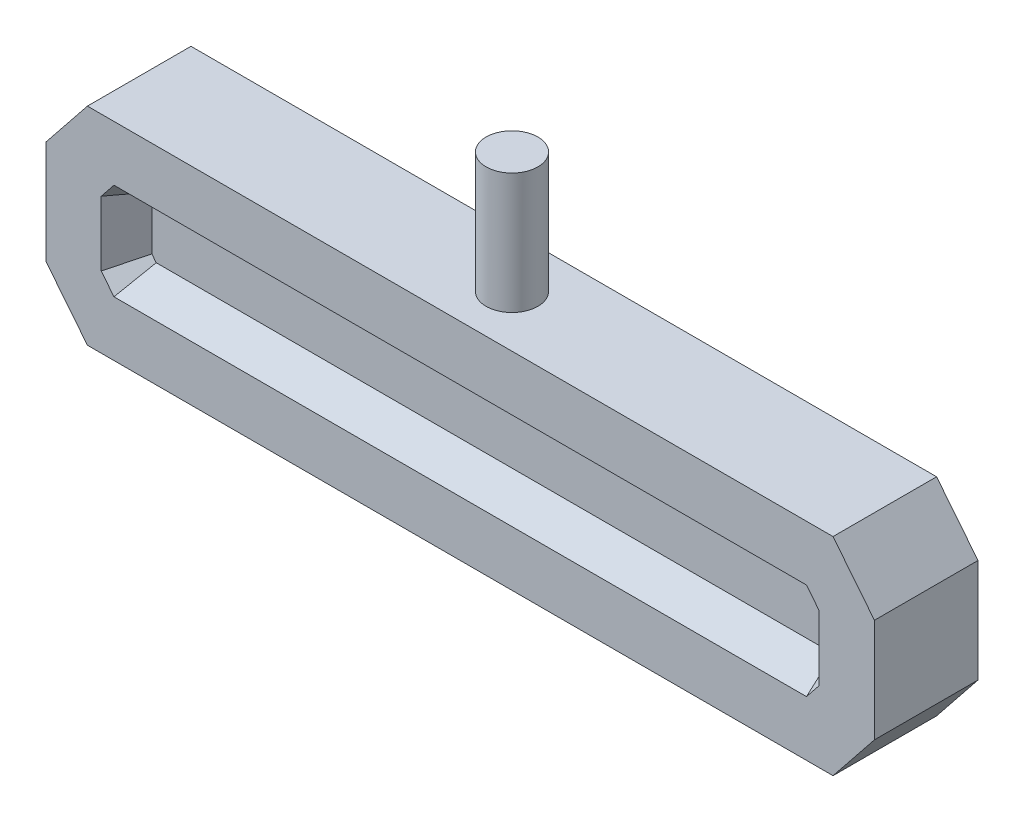
ISO-10303-21;
HEADER;
FILE_DESCRIPTION(('STEP AP214'),'2;1');
FILE_NAME('part.step','',(''),(''),'','','');
FILE_SCHEMA(('AUTOMOTIVE_DESIGN { 1 0 10303 214 1 1 1 1 }'));
ENDSEC;
DATA;
#1=APPLICATION_CONTEXT('core data for automotive mechanical design processes');
#2=APPLICATION_PROTOCOL_DEFINITION('international standard','automotive_design',2000,#1);
#3=PRODUCT_CONTEXT('',#1,'mechanical');
#4=PRODUCT('Part','Part','',(#3));
#5=PRODUCT_RELATED_PRODUCT_CATEGORY('part','',(#4));
#6=PRODUCT_DEFINITION_FORMATION('','',#4);
#7=PRODUCT_DEFINITION_CONTEXT('part definition',#1,'design');
#8=PRODUCT_DEFINITION('design','',#6,#7);
#9=PRODUCT_DEFINITION_SHAPE('','',#8);
#10=(LENGTH_UNIT() NAMED_UNIT(*) SI_UNIT(.MILLI.,.METRE.));
#11=(NAMED_UNIT(*) PLANE_ANGLE_UNIT() SI_UNIT($,.RADIAN.));
#12=(NAMED_UNIT(*) SI_UNIT($,.STERADIAN.) SOLID_ANGLE_UNIT());
#13=UNCERTAINTY_MEASURE_WITH_UNIT(LENGTH_MEASURE(1.E-05),#10,'distance_accuracy_value','');
#14=(GEOMETRIC_REPRESENTATION_CONTEXT(3) GLOBAL_UNCERTAINTY_ASSIGNED_CONTEXT((#13)) GLOBAL_UNIT_ASSIGNED_CONTEXT((#10,
#11,#12)) REPRESENTATION_CONTEXT('',''));
#15=CARTESIAN_POINT('',(0.,0.,0.));
#16=DIRECTION('',(0.,0.,1.));
#17=DIRECTION('',(1.,0.,0.));
#18=AXIS2_PLACEMENT_3D('',#15,#16,#17);
#19=CARTESIAN_POINT('',(0.,0.,19.05));
#20=DIRECTION('',(0.,0.,-1.));
#21=DIRECTION('',(-1.,0.,0.));
#22=AXIS2_PLACEMENT_3D('',#19,#20,#21);
#23=PLANE('',#22);
#24=DIRECTION('',(-0.624695047554425,0.78086880944303,0.));
#25=VECTOR('',#24,1.);
#26=CARTESIAN_POINT('',(137.16,76.2,19.05));
#27=LINE('',#26,#25);
#28=CARTESIAN_POINT('',(152.4,57.15,19.05));
#29=VERTEX_POINT('',#28);
#30=CARTESIAN_POINT('',(137.16,76.2,19.05));
#31=VERTEX_POINT('',#30);
#32=EDGE_CURVE('E249',#29,#31,#27,.T.);
#33=ORIENTED_EDGE('',*,*,#32,.T.);
#34=DIRECTION('',(-1.,0.,0.));
#35=VECTOR('',#34,1.);
#36=CARTESIAN_POINT('',(-137.16,76.2,19.05));
#37=LINE('',#36,#35);
#38=CARTESIAN_POINT('',(-137.16,76.2,19.05));
#39=VERTEX_POINT('',#38);
#40=EDGE_CURVE('E177',#31,#39,#37,.T.);
#41=ORIENTED_EDGE('',*,*,#40,.T.);
#42=DIRECTION('',(-0.624695047554425,-0.78086880944303,0.));
#43=VECTOR('',#42,1.);
#44=CARTESIAN_POINT('',(-137.16,76.2,19.05));
#45=LINE('',#44,#43);
#46=CARTESIAN_POINT('',(-152.4,57.15,19.05));
#47=VERTEX_POINT('',#46);
#48=EDGE_CURVE('E288',#39,#47,#45,.T.);
#49=ORIENTED_EDGE('',*,*,#48,.T.);
#50=DIRECTION('',(0.,-1.,0.));
#51=VECTOR('',#50,1.);
#52=CARTESIAN_POINT('',(-152.4,57.15,19.05));
#53=LINE('',#52,#51);
#54=CARTESIAN_POINT('',(-152.4,19.05,19.05));
#55=VERTEX_POINT('',#54);
#56=EDGE_CURVE('E286',#47,#55,#53,.T.);
#57=ORIENTED_EDGE('',*,*,#56,.T.);
#58=DIRECTION('',(0.624695047554424,-0.780868809443031,0.));
#59=VECTOR('',#58,1.);
#60=CARTESIAN_POINT('',(-152.4,19.05,19.05));
#61=LINE('',#60,#59);
#62=CARTESIAN_POINT('',(-137.16,0.,19.05));
#63=VERTEX_POINT('',#62);
#64=EDGE_CURVE('E200',#55,#63,#61,.T.);
#65=ORIENTED_EDGE('',*,*,#64,.T.);
#66=DIRECTION('',(1.,0.,0.));
#67=VECTOR('',#66,1.);
#68=CARTESIAN_POINT('',(137.16,0.,19.05));
#69=LINE('',#68,#67);
#70=CARTESIAN_POINT('',(137.16,0.,19.05));
#71=VERTEX_POINT('',#70);
#72=EDGE_CURVE('E193',#63,#71,#69,.T.);
#73=ORIENTED_EDGE('',*,*,#72,.T.);
#74=DIRECTION('',(0.624695047554424,0.780868809443031,0.));
#75=VECTOR('',#74,1.);
#76=CARTESIAN_POINT('',(152.4,19.05,19.05));
#77=LINE('',#76,#75);
#78=CARTESIAN_POINT('',(152.4,19.05,19.05));
#79=VERTEX_POINT('',#78);
#80=EDGE_CURVE('E197',#71,#79,#77,.T.);
#81=ORIENTED_EDGE('',*,*,#80,.T.);
#82=DIRECTION('',(0.,1.,0.));
#83=VECTOR('',#82,1.);
#84=CARTESIAN_POINT('',(152.4,57.15,19.05));
#85=LINE('',#84,#83);
#86=EDGE_CURVE('E135',#79,#29,#85,.T.);
#87=ORIENTED_EDGE('',*,*,#86,.T.);
#88=EDGE_LOOP('',(#33,#41,#49,#57,#65,#73,#81,#87));
#89=FACE_BOUND('',#88,.T.);
#90=DIRECTION('',(0.624695047554436,-0.780868809443021,0.));
#91=VECTOR('',#90,1.);
#92=CARTESIAN_POINT('',(-132.08,26.1778711261586,19.05));
#93=LINE('',#92,#91);
#94=CARTESIAN_POINT('',(-132.08,26.1778711261586,19.05));
#95=VERTEX_POINT('',#94);
#96=CARTESIAN_POINT('',(-127.393703099073,20.3200000000005,19.05));
#97=VERTEX_POINT('',#96);
#98=EDGE_CURVE('E126',#95,#97,#93,.T.);
#99=ORIENTED_EDGE('',*,*,#98,.F.);
#100=DIRECTION('',(0.,-1.,0.));
#101=VECTOR('',#100,1.);
#102=CARTESIAN_POINT('',(-132.08,50.022128873841,19.05));
#103=LINE('',#102,#101);
#104=CARTESIAN_POINT('',(-132.08,50.022128873841,19.05));
#105=VERTEX_POINT('',#104);
#106=EDGE_CURVE('E327',#105,#95,#103,.T.);
#107=ORIENTED_EDGE('',*,*,#106,.F.);
#108=DIRECTION('',(-0.624695047554414,-0.780868809443039,0.));
#109=VECTOR('',#108,1.);
#110=CARTESIAN_POINT('',(-127.393703099073,55.88,19.05));
#111=LINE('',#110,#109);
#112=CARTESIAN_POINT('',(-127.393703099073,55.88,19.05));
#113=VERTEX_POINT('',#112);
#114=EDGE_CURVE('E321',#113,#105,#111,.T.);
#115=ORIENTED_EDGE('',*,*,#114,.F.);
#116=DIRECTION('',(-1.,0.,0.));
#117=VECTOR('',#116,1.);
#118=CARTESIAN_POINT('',(127.393703099073,55.8800000000001,19.05));
#119=LINE('',#118,#117);
#120=CARTESIAN_POINT('',(127.393703099073,55.8800000000001,19.05));
#121=VERTEX_POINT('',#120);
#122=EDGE_CURVE('E315',#121,#113,#119,.T.);
#123=ORIENTED_EDGE('',*,*,#122,.F.);
#124=DIRECTION('',(-0.62469504755443,0.780868809443026,0.));
#125=VECTOR('',#124,1.);
#126=CARTESIAN_POINT('',(132.08,50.0221288738412,19.05));
#127=LINE('',#126,#125);
#128=CARTESIAN_POINT('',(132.08,50.0221288738412,19.05));
#129=VERTEX_POINT('',#128);
#130=EDGE_CURVE('E309',#129,#121,#127,.T.);
#131=ORIENTED_EDGE('',*,*,#130,.F.);
#132=DIRECTION('',(0.,1.,0.));
#133=VECTOR('',#132,1.);
#134=CARTESIAN_POINT('',(132.080000000001,26.1778711261595,19.05));
#135=LINE('',#134,#133);
#136=CARTESIAN_POINT('',(132.080000000001,26.1778711261595,19.05));
#137=VERTEX_POINT('',#136);
#138=EDGE_CURVE('E303',#137,#129,#135,.T.);
#139=ORIENTED_EDGE('',*,*,#138,.F.);
#140=DIRECTION('',(0.624695047554415,0.780868809443037,0.));
#141=VECTOR('',#140,1.);
#142=CARTESIAN_POINT('',(127.393703099073,20.32,19.05));
#143=LINE('',#142,#141);
#144=CARTESIAN_POINT('',(127.393703099073,20.32,19.05));
#145=VERTEX_POINT('',#144);
#146=EDGE_CURVE('E344',#145,#137,#143,.T.);
#147=ORIENTED_EDGE('',*,*,#146,.F.);
#148=DIRECTION('',(1.,0.,0.));
#149=VECTOR('',#148,1.);
#150=CARTESIAN_POINT('',(-127.393703099073,20.3200000000004,19.05));
#151=LINE('',#150,#149);
#152=EDGE_CURVE('E230',#97,#145,#151,.T.);
#153=ORIENTED_EDGE('',*,*,#152,.F.);
#154=EDGE_LOOP('',(#99,#107,#115,#123,#131,#139,#147,#153));
#155=FACE_BOUND('',#154,.T.);
#156=ADVANCED_FACE('F110',(#89,#155),#23,.F.);
#157=CARTESIAN_POINT('',(137.16,76.2,19.05));
#158=DIRECTION('',(-0.78086880944303,-0.624695047554425,0.));
#159=DIRECTION('',(0.624695047554425,-0.78086880944303,0.));
#160=AXIS2_PLACEMENT_3D('',#157,#158,#159);
#161=PLANE('',#160);
#162=DIRECTION('',(-0.624695047554425,0.78086880944303,0.));
#163=VECTOR('',#162,1.);
#164=CARTESIAN_POINT('',(137.16,76.2,-19.05));
#165=LINE('',#164,#163);
#166=CARTESIAN_POINT('',(152.4,57.15,-19.05));
#167=VERTEX_POINT('',#166);
#168=CARTESIAN_POINT('',(137.16,76.2,-19.05));
#169=VERTEX_POINT('',#168);
#170=EDGE_CURVE('E225',#167,#169,#165,.T.);
#171=ORIENTED_EDGE('',*,*,#170,.T.);
#172=DIRECTION('',(0.,0.,-1.));
#173=VECTOR('',#172,1.);
#174=CARTESIAN_POINT('',(137.16,76.2,19.05));
#175=LINE('',#174,#173);
#176=EDGE_CURVE('E119',#31,#169,#175,.T.);
#177=ORIENTED_EDGE('',*,*,#176,.F.);
#178=ORIENTED_EDGE('',*,*,#32,.F.);
#179=DIRECTION('',(0.,0.,-1.));
#180=VECTOR('',#179,1.);
#181=CARTESIAN_POINT('',(152.4,57.15,19.05));
#182=LINE('',#181,#180);
#183=EDGE_CURVE('E221',#29,#167,#182,.T.);
#184=ORIENTED_EDGE('',*,*,#183,.T.);
#185=EDGE_LOOP('',(#171,#177,#178,#184));
#186=FACE_BOUND('',#185,.T.);
#187=ADVANCED_FACE('F112',(#186),#161,.F.);
#188=CARTESIAN_POINT('',(-137.16,76.2,19.05));
#189=DIRECTION('',(0.,-1.,0.));
#190=DIRECTION('',(0.,0.,-1.));
#191=AXIS2_PLACEMENT_3D('',#188,#189,#190);
#192=PLANE('',#191);
#193=CARTESIAN_POINT('',(0.,76.2,0.));
#194=DIRECTION('',(0.,-1.,0.));
#195=DIRECTION('',(0.,0.,-1.));
#196=AXIS2_PLACEMENT_3D('',#193,#194,#195);
#197=CIRCLE('',#196,9.525);
#198=CARTESIAN_POINT('',(0.,76.2,-9.525));
#199=VERTEX_POINT('',#198);
#200=EDGE_CURVE('E12',#199,#199,#197,.F.);
#201=ORIENTED_EDGE('',*,*,#200,.F.);
#202=EDGE_LOOP('',(#201));
#203=FACE_BOUND('',#202,.T.);
#204=DIRECTION('',(-1.,0.,0.));
#205=VECTOR('',#204,1.);
#206=CARTESIAN_POINT('',(-137.16,76.2,-19.05));
#207=LINE('',#206,#205);
#208=CARTESIAN_POINT('',(-137.16,76.2,-19.05));
#209=VERTEX_POINT('',#208);
#210=EDGE_CURVE('E229',#169,#209,#207,.T.);
#211=ORIENTED_EDGE('',*,*,#210,.T.);
#212=DIRECTION('',(0.,0.,-1.));
#213=VECTOR('',#212,1.);
#214=CARTESIAN_POINT('',(-137.16,76.2,19.05));
#215=LINE('',#214,#213);
#216=EDGE_CURVE('E264',#39,#209,#215,.T.);
#217=ORIENTED_EDGE('',*,*,#216,.F.);
#218=ORIENTED_EDGE('',*,*,#40,.F.);
#219=ORIENTED_EDGE('',*,*,#176,.T.);
#220=EDGE_LOOP('',(#211,#217,#218,#219));
#221=FACE_BOUND('',#220,.T.);
#222=ADVANCED_FACE('F269',(#203,#221),#192,.F.);
#223=CARTESIAN_POINT('',(-137.16,76.2,19.05));
#224=DIRECTION('',(0.78086880944303,-0.624695047554425,0.));
#225=DIRECTION('',(0.624695047554425,0.78086880944303,0.));
#226=AXIS2_PLACEMENT_3D('',#223,#224,#225);
#227=PLANE('',#226);
#228=DIRECTION('',(-0.624695047554425,-0.78086880944303,0.));
#229=VECTOR('',#228,1.);
#230=CARTESIAN_POINT('',(-137.16,76.2,-19.05));
#231=LINE('',#230,#229);
#232=CARTESIAN_POINT('',(-152.4,57.15,-19.05));
#233=VERTEX_POINT('',#232);
#234=EDGE_CURVE('E233',#209,#233,#231,.T.);
#235=ORIENTED_EDGE('',*,*,#234,.T.);
#236=DIRECTION('',(0.,0.,-1.));
#237=VECTOR('',#236,1.);
#238=CARTESIAN_POINT('',(-152.4,57.15,19.05));
#239=LINE('',#238,#237);
#240=EDGE_CURVE('E260',#47,#233,#239,.T.);
#241=ORIENTED_EDGE('',*,*,#240,.F.);
#242=ORIENTED_EDGE('',*,*,#48,.F.);
#243=ORIENTED_EDGE('',*,*,#216,.T.);
#244=EDGE_LOOP('',(#235,#241,#242,#243));
#245=FACE_BOUND('',#244,.T.);
#246=ADVANCED_FACE('F280',(#245),#227,.F.);
#247=CARTESIAN_POINT('',(-152.4,57.15,19.05));
#248=DIRECTION('',(1.,0.,0.));
#249=DIRECTION('',(0.,0.,-1.));
#250=AXIS2_PLACEMENT_3D('',#247,#248,#249);
#251=PLANE('',#250);
#252=DIRECTION('',(0.,-1.,0.));
#253=VECTOR('',#252,1.);
#254=CARTESIAN_POINT('',(-152.4,57.15,-19.05));
#255=LINE('',#254,#253);
#256=CARTESIAN_POINT('',(-152.4,19.05,-19.05));
#257=VERTEX_POINT('',#256);
#258=EDGE_CURVE('E236',#233,#257,#255,.T.);
#259=ORIENTED_EDGE('',*,*,#258,.T.);
#260=DIRECTION('',(0.,0.,-1.));
#261=VECTOR('',#260,1.);
#262=CARTESIAN_POINT('',(-152.4,19.05,19.05));
#263=LINE('',#262,#261);
#264=EDGE_CURVE('E256',#55,#257,#263,.T.);
#265=ORIENTED_EDGE('',*,*,#264,.F.);
#266=ORIENTED_EDGE('',*,*,#56,.F.);
#267=ORIENTED_EDGE('',*,*,#240,.T.);
#268=EDGE_LOOP('',(#259,#265,#266,#267));
#269=FACE_BOUND('',#268,.T.);
#270=ADVANCED_FACE('F284',(#269),#251,.F.);
#271=CARTESIAN_POINT('',(-152.4,19.05,19.05));
#272=DIRECTION('',(0.780868809443031,0.624695047554424,0.));
#273=DIRECTION('',(-0.624695047554424,0.780868809443031,0.));
#274=AXIS2_PLACEMENT_3D('',#271,#272,#273);
#275=PLANE('',#274);
#276=DIRECTION('',(0.624695047554424,-0.780868809443031,0.));
#277=VECTOR('',#276,1.);
#278=CARTESIAN_POINT('',(-152.4,19.05,-19.05));
#279=LINE('',#278,#277);
#280=CARTESIAN_POINT('',(-137.16,0.,-19.05));
#281=VERTEX_POINT('',#280);
#282=EDGE_CURVE('E239',#257,#281,#279,.T.);
#283=ORIENTED_EDGE('',*,*,#282,.T.);
#284=DIRECTION('',(0.,0.,-1.));
#285=VECTOR('',#284,1.);
#286=CARTESIAN_POINT('',(-137.16,0.,19.05));
#287=LINE('',#286,#285);
#288=EDGE_CURVE('E214',#63,#281,#287,.T.);
#289=ORIENTED_EDGE('',*,*,#288,.F.);
#290=ORIENTED_EDGE('',*,*,#64,.F.);
#291=ORIENTED_EDGE('',*,*,#264,.T.);
#292=EDGE_LOOP('',(#283,#289,#290,#291));
#293=FACE_BOUND('',#292,.T.);
#294=ADVANCED_FACE('F430',(#293),#275,.F.);
#295=CARTESIAN_POINT('',(137.16,0.,19.05));
#296=DIRECTION('',(0.,1.,0.));
#297=DIRECTION('',(0.,0.,1.));
#298=AXIS2_PLACEMENT_3D('',#295,#296,#297);
#299=PLANE('',#298);
#300=DIRECTION('',(1.,0.,0.));
#301=VECTOR('',#300,1.);
#302=CARTESIAN_POINT('',(137.16,0.,-19.05));
#303=LINE('',#302,#301);
#304=CARTESIAN_POINT('',(137.16,0.,-19.05));
#305=VERTEX_POINT('',#304);
#306=EDGE_CURVE('E210',#281,#305,#303,.T.);
#307=ORIENTED_EDGE('',*,*,#306,.T.);
#308=DIRECTION('',(0.,0.,-1.));
#309=VECTOR('',#308,1.);
#310=CARTESIAN_POINT('',(137.16,0.,19.05));
#311=LINE('',#310,#309);
#312=EDGE_CURVE('E207',#71,#305,#311,.T.);
#313=ORIENTED_EDGE('',*,*,#312,.F.);
#314=ORIENTED_EDGE('',*,*,#72,.F.);
#315=ORIENTED_EDGE('',*,*,#288,.T.);
#316=EDGE_LOOP('',(#307,#313,#314,#315));
#317=FACE_BOUND('',#316,.T.);
#318=ADVANCED_FACE('F208',(#317),#299,.F.);
#319=CARTESIAN_POINT('',(152.4,19.05,19.05));
#320=DIRECTION('',(-0.780868809443031,0.624695047554424,0.));
#321=DIRECTION('',(-0.624695047554424,-0.780868809443031,0.));
#322=AXIS2_PLACEMENT_3D('',#319,#320,#321);
#323=PLANE('',#322);
#324=DIRECTION('',(0.624695047554424,0.780868809443031,0.));
#325=VECTOR('',#324,1.);
#326=CARTESIAN_POINT('',(152.4,19.05,-19.05));
#327=LINE('',#326,#325);
#328=CARTESIAN_POINT('',(152.4,19.05,-19.05));
#329=VERTEX_POINT('',#328);
#330=EDGE_CURVE('E244',#305,#329,#327,.T.);
#331=ORIENTED_EDGE('',*,*,#330,.T.);
#332=DIRECTION('',(0.,0.,-1.));
#333=VECTOR('',#332,1.);
#334=CARTESIAN_POINT('',(152.4,19.05,19.05));
#335=LINE('',#334,#333);
#336=EDGE_CURVE('E215',#79,#329,#335,.T.);
#337=ORIENTED_EDGE('',*,*,#336,.F.);
#338=ORIENTED_EDGE('',*,*,#80,.F.);
#339=ORIENTED_EDGE('',*,*,#312,.T.);
#340=EDGE_LOOP('',(#331,#337,#338,#339));
#341=FACE_BOUND('',#340,.T.);
#342=ADVANCED_FACE('F217',(#341),#323,.F.);
#343=CARTESIAN_POINT('',(152.4,57.15,19.05));
#344=DIRECTION('',(-1.,0.,0.));
#345=DIRECTION('',(0.,0.,1.));
#346=AXIS2_PLACEMENT_3D('',#343,#344,#345);
#347=PLANE('',#346);
#348=DIRECTION('',(0.,1.,0.));
#349=VECTOR('',#348,1.);
#350=CARTESIAN_POINT('',(152.4,57.15,-19.05));
#351=LINE('',#350,#349);
#352=EDGE_CURVE('E168',#329,#167,#351,.T.);
#353=ORIENTED_EDGE('',*,*,#352,.T.);
#354=ORIENTED_EDGE('',*,*,#183,.F.);
#355=ORIENTED_EDGE('',*,*,#86,.F.);
#356=ORIENTED_EDGE('',*,*,#336,.T.);
#357=EDGE_LOOP('',(#353,#354,#355,#356));
#358=FACE_BOUND('',#357,.T.);
#359=ADVANCED_FACE('F423',(#358),#347,.F.);
#360=CARTESIAN_POINT('',(0.,0.,-19.05));
#361=DIRECTION('',(0.,0.,-1.));
#362=DIRECTION('',(-1.,0.,0.));
#363=AXIS2_PLACEMENT_3D('',#360,#361,#362);
#364=PLANE('',#363);
#365=ORIENTED_EDGE('',*,*,#170,.F.);
#366=ORIENTED_EDGE('',*,*,#352,.F.);
#367=ORIENTED_EDGE('',*,*,#330,.F.);
#368=ORIENTED_EDGE('',*,*,#306,.F.);
#369=ORIENTED_EDGE('',*,*,#282,.F.);
#370=ORIENTED_EDGE('',*,*,#258,.F.);
#371=ORIENTED_EDGE('',*,*,#234,.F.);
#372=ORIENTED_EDGE('',*,*,#210,.F.);
#373=EDGE_LOOP('',(#365,#366,#367,#368,#369,#370,#371,#372));
#374=FACE_BOUND('',#373,.T.);
#375=ADVANCED_FACE('F274',(#374),#364,.T.);
#376=CARTESIAN_POINT('',(0.,0.,6.35000000000006));
#377=DIRECTION('',(0.,0.,-1.));
#378=DIRECTION('',(-1.,0.,0.));
#379=AXIS2_PLACEMENT_3D('',#376,#377,#378);
#380=PLANE('',#379);
#381=DIRECTION('',(-1.,0.,0.));
#382=VECTOR('',#381,1.);
#383=CARTESIAN_POINT('',(0.,26.2421072585687,6.35000000000006));
#384=LINE('',#383,#382);
#385=CARTESIAN_POINT('',(-124.547391201125,26.2421072585689,6.35000000000006));
#386=VERTEX_POINT('',#385);
#387=CARTESIAN_POINT('',(124.547391201124,26.2421072585685,6.35000000000006));
#388=VERTEX_POINT('',#387);
#389=EDGE_CURVE('E340',#386,#388,#384,.F.);
#390=ORIENTED_EDGE('',*,*,#389,.T.);
#391=DIRECTION('',(-0.624695047554416,-0.780868809443037,0.));
#392=VECTOR('',#391,1.);
#393=CARTESIAN_POINT('',(63.1425032891902,-50.514002631351,6.35000000000006));
#394=LINE('',#393,#392);
#395=CARTESIAN_POINT('',(126.157892741432,28.255234183953,6.35000000000006));
#396=VERTEX_POINT('',#395);
#397=EDGE_CURVE('E298',#388,#396,#394,.F.);
#398=ORIENTED_EDGE('',*,*,#397,.T.);
#399=DIRECTION('',(0.,-1.,0.));
#400=VECTOR('',#399,1.);
#401=CARTESIAN_POINT('',(126.157892741433,2.93704670411364E-12,6.35000000000006));
#402=LINE('',#401,#400);
#403=CARTESIAN_POINT('',(126.157892741432,47.9447658160476,6.35000000000006));
#404=VERTEX_POINT('',#403);
#405=EDGE_CURVE('E304',#396,#404,#402,.F.);
#406=ORIENTED_EDGE('',*,*,#405,.T.);
#407=DIRECTION('',(0.62469504755443,-0.780868809443026,0.));
#408=VECTOR('',#407,1.);
#409=CARTESIAN_POINT('',(100.313234996505,80.2505879972053,6.35000000000006));
#410=LINE('',#409,#408);
#411=CARTESIAN_POINT('',(124.547391201124,49.9578927414316,6.35000000000006));
#412=VERTEX_POINT('',#411);
#413=EDGE_CURVE('E310',#404,#412,#410,.F.);
#414=ORIENTED_EDGE('',*,*,#413,.T.);
#415=DIRECTION('',(1.,0.,0.));
#416=VECTOR('',#415,1.);
#417=CARTESIAN_POINT('',(0.,49.9578927414316,6.35000000000006));
#418=LINE('',#417,#416);
#419=CARTESIAN_POINT('',(-124.547391201124,49.9578927414315,6.35000000000006));
#420=VERTEX_POINT('',#419);
#421=EDGE_CURVE('E316',#412,#420,#418,.F.);
#422=ORIENTED_EDGE('',*,*,#421,.T.);
#423=DIRECTION('',(0.624695047554414,0.780868809443039,0.));
#424=VECTOR('',#423,1.);
#425=CARTESIAN_POINT('',(-100.313234996507,80.2505879972037,6.35000000000006));
#426=LINE('',#425,#424);
#427=CARTESIAN_POINT('',(-126.157892741432,47.9447658160474,6.35000000000006));
#428=VERTEX_POINT('',#427);
#429=EDGE_CURVE('E322',#420,#428,#426,.F.);
#430=ORIENTED_EDGE('',*,*,#429,.T.);
#431=DIRECTION('',(0.,1.,0.));
#432=VECTOR('',#431,1.);
#433=CARTESIAN_POINT('',(-126.157892741431,-7.34261676028382E-13,6.35000000000006));
#434=LINE('',#433,#432);
#435=CARTESIAN_POINT('',(-126.157892741432,28.2552341839523,6.35000000000006));
#436=VERTEX_POINT('',#435);
#437=EDGE_CURVE('E328',#428,#436,#434,.F.);
#438=ORIENTED_EDGE('',*,*,#437,.T.);
#439=DIRECTION('',(-0.624695047554436,0.780868809443021,0.));
#440=VECTOR('',#439,1.);
#441=CARTESIAN_POINT('',(-63.1425032891869,-50.5140026313511,6.35000000000006));
#442=LINE('',#441,#440);
#443=EDGE_CURVE('E334',#436,#386,#442,.F.);
#444=ORIENTED_EDGE('',*,*,#443,.T.);
#445=EDGE_LOOP('',(#390,#398,#406,#414,#422,#430,#438,#444));
#446=FACE_BOUND('',#445,.T.);
#447=ADVANCED_FACE('F402',(#446),#380,.F.);
#448=CARTESIAN_POINT('',(-132.08,26.1778711261586,19.05));
#449=DIRECTION('',(-0.707707482652248,-0.566165986121816,-0.4226182617407));
#450=DIRECTION('',(0.624695047554436,-0.780868809443021,0.));
#451=AXIS2_PLACEMENT_3D('',#448,#449,#450);
#452=PLANE('',#451);
#453=ORIENTED_EDGE('',*,*,#443,.F.);
#454=DIRECTION('',(0.41804948651856,0.146643841745142,-0.89651001695452));
#455=VECTOR('',#454,1.);
#456=CARTESIAN_POINT('',(-132.08,26.1778711261586,19.05));
#457=LINE('',#456,#455);
#458=EDGE_CURVE('E338',#95,#436,#457,.T.);
#459=ORIENTED_EDGE('',*,*,#458,.F.);
#460=ORIENTED_EDGE('',*,*,#98,.T.);
#461=DIRECTION('',(0.199056006814326,0.414160873819351,-0.888170860109882));
#462=VECTOR('',#461,1.);
#463=CARTESIAN_POINT('',(-127.393703099073,20.3200000000004,19.05));
#464=LINE('',#463,#462);
#465=EDGE_CURVE('E333',#97,#386,#464,.T.);
#466=ORIENTED_EDGE('',*,*,#465,.T.);
#467=EDGE_LOOP('',(#453,#459,#460,#466));
#468=FACE_BOUND('',#467,.T.);
#469=ADVANCED_FACE('F420',(#468),#452,.F.);
#470=CARTESIAN_POINT('',(-132.08,50.022128873841,19.05));
#471=DIRECTION('',(-0.90630778703665,0.,-0.4226182617407));
#472=DIRECTION('',(-0.4226182617407,0.,0.90630778703665));
#473=AXIS2_PLACEMENT_3D('',#470,#471,#472);
#474=PLANE('',#473);
#475=ORIENTED_EDGE('',*,*,#437,.F.);
#476=DIRECTION('',(0.418049486518562,-0.146643841745133,-0.89651001695452));
#477=VECTOR('',#476,1.);
#478=CARTESIAN_POINT('',(-132.08,50.022128873841,19.05));
#479=LINE('',#478,#477);
#480=EDGE_CURVE('E332',#105,#428,#479,.T.);
#481=ORIENTED_EDGE('',*,*,#480,.F.);
#482=ORIENTED_EDGE('',*,*,#106,.T.);
#483=ORIENTED_EDGE('',*,*,#458,.T.);
#484=EDGE_LOOP('',(#475,#481,#482,#483));
#485=FACE_BOUND('',#484,.T.);
#486=ADVANCED_FACE('F486',(#485),#474,.F.);
#487=CARTESIAN_POINT('',(-127.393703099073,55.88,19.05));
#488=DIRECTION('',(-0.707707482652264,0.566165986121795,-0.4226182617407));
#489=DIRECTION('',(-0.624695047554414,-0.780868809443039,0.));
#490=AXIS2_PLACEMENT_3D('',#487,#488,#489);
#491=PLANE('',#490);
#492=ORIENTED_EDGE('',*,*,#429,.F.);
#493=DIRECTION('',(0.199056006814333,-0.41416087381935,-0.88817086010988));
#494=VECTOR('',#493,1.);
#495=CARTESIAN_POINT('',(-127.393703099073,55.88,19.05));
#496=LINE('',#495,#494);
#497=EDGE_CURVE('E326',#113,#420,#496,.T.);
#498=ORIENTED_EDGE('',*,*,#497,.F.);
#499=ORIENTED_EDGE('',*,*,#114,.T.);
#500=ORIENTED_EDGE('',*,*,#480,.T.);
#501=EDGE_LOOP('',(#492,#498,#499,#500));
#502=FACE_BOUND('',#501,.T.);
#503=ADVANCED_FACE('F494',(#502),#491,.F.);
#504=CARTESIAN_POINT('',(127.393703099073,55.8800000000001,19.05));
#505=DIRECTION('',(0.,0.90630778703665,-0.4226182617407));
#506=DIRECTION('',(0.,0.4226182617407,0.90630778703665));
#507=AXIS2_PLACEMENT_3D('',#504,#505,#506);
#508=PLANE('',#507);
#509=ORIENTED_EDGE('',*,*,#421,.F.);
#510=DIRECTION('',(-0.199056006814328,-0.414160873819351,-0.888170860109881));
#511=VECTOR('',#510,1.);
#512=CARTESIAN_POINT('',(127.393703099073,55.8800000000001,19.05));
#513=LINE('',#512,#511);
#514=EDGE_CURVE('E320',#121,#412,#513,.T.);
#515=ORIENTED_EDGE('',*,*,#514,.F.);
#516=ORIENTED_EDGE('',*,*,#122,.T.);
#517=ORIENTED_EDGE('',*,*,#497,.T.);
#518=EDGE_LOOP('',(#509,#515,#516,#517));
#519=FACE_BOUND('',#518,.T.);
#520=ADVANCED_FACE('F503',(#519),#508,.F.);
#521=CARTESIAN_POINT('',(132.08,50.0221288738412,19.05));
#522=DIRECTION('',(0.707707482652252,0.56616598612181,-0.4226182617407));
#523=DIRECTION('',(-0.62469504755443,0.780868809443026,0.));
#524=AXIS2_PLACEMENT_3D('',#521,#522,#523);
#525=PLANE('',#524);
#526=ORIENTED_EDGE('',*,*,#413,.F.);
#527=DIRECTION('',(-0.418049486518558,-0.146643841745144,-0.896510016954521));
#528=VECTOR('',#527,1.);
#529=CARTESIAN_POINT('',(132.08,50.0221288738412,19.05));
#530=LINE('',#529,#528);
#531=EDGE_CURVE('E314',#129,#404,#530,.T.);
#532=ORIENTED_EDGE('',*,*,#531,.F.);
#533=ORIENTED_EDGE('',*,*,#130,.T.);
#534=ORIENTED_EDGE('',*,*,#514,.T.);
#535=EDGE_LOOP('',(#526,#532,#533,#534));
#536=FACE_BOUND('',#535,.T.);
#537=ADVANCED_FACE('F513',(#536),#525,.F.);
#538=CARTESIAN_POINT('',(132.080000000001,26.1778711261595,19.05));
#539=DIRECTION('',(0.90630778703665,0.,-0.4226182617407));
#540=DIRECTION('',(-0.4226182617407,0.,-0.90630778703665));
#541=AXIS2_PLACEMENT_3D('',#538,#539,#540);
#542=PLANE('',#541);
#543=ORIENTED_EDGE('',*,*,#405,.F.);
#544=DIRECTION('',(-0.418049486518565,0.146643841745131,-0.89651001695452));
#545=VECTOR('',#544,1.);
#546=CARTESIAN_POINT('',(132.080000000001,26.1778711261595,19.05));
#547=LINE('',#546,#545);
#548=EDGE_CURVE('E308',#137,#396,#547,.T.);
#549=ORIENTED_EDGE('',*,*,#548,.F.);
#550=ORIENTED_EDGE('',*,*,#138,.T.);
#551=ORIENTED_EDGE('',*,*,#531,.T.);
#552=EDGE_LOOP('',(#543,#549,#550,#551));
#553=FACE_BOUND('',#552,.T.);
#554=ADVANCED_FACE('F523',(#553),#542,.F.);
#555=CARTESIAN_POINT('',(127.393703099073,20.32,19.05));
#556=DIRECTION('',(0.707707482652262,-0.566165986121797,-0.4226182617407));
#557=DIRECTION('',(0.624695047554416,0.780868809443037,0.));
#558=AXIS2_PLACEMENT_3D('',#555,#556,#557);
#559=PLANE('',#558);
#560=ORIENTED_EDGE('',*,*,#397,.F.);
#561=DIRECTION('',(-0.199056006814332,0.414160873819351,-0.88817086010988));
#562=VECTOR('',#561,1.);
#563=CARTESIAN_POINT('',(127.393703099073,20.32,19.05));
#564=LINE('',#563,#562);
#565=EDGE_CURVE('E302',#145,#388,#564,.T.);
#566=ORIENTED_EDGE('',*,*,#565,.F.);
#567=ORIENTED_EDGE('',*,*,#146,.T.);
#568=ORIENTED_EDGE('',*,*,#548,.T.);
#569=EDGE_LOOP('',(#560,#566,#567,#568));
#570=FACE_BOUND('',#569,.T.);
#571=ADVANCED_FACE('F533',(#570),#559,.F.);
#572=CARTESIAN_POINT('',(-127.393703099073,20.3200000000004,19.05));
#573=DIRECTION('',(0.,-0.90630778703665,-0.4226182617407));
#574=DIRECTION('',(0.,0.4226182617407,-0.90630778703665));
#575=AXIS2_PLACEMENT_3D('',#572,#573,#574);
#576=PLANE('',#575);
#577=ORIENTED_EDGE('',*,*,#389,.F.);
#578=ORIENTED_EDGE('',*,*,#465,.F.);
#579=ORIENTED_EDGE('',*,*,#152,.T.);
#580=ORIENTED_EDGE('',*,*,#565,.T.);
#581=EDGE_LOOP('',(#577,#578,#579,#580));
#582=FACE_BOUND('',#581,.T.);
#583=ADVANCED_FACE('F400',(#582),#576,.F.);
#584=CARTESIAN_POINT('',(0.,120.65,0.));
#585=DIRECTION('',(0.,-1.,0.));
#586=DIRECTION('',(0.,0.,-1.));
#587=AXIS2_PLACEMENT_3D('',#584,#585,#586);
#588=CYLINDRICAL_SURFACE('',#587,9.525);
#589=CARTESIAN_POINT('',(0.,120.65,0.));
#590=DIRECTION('',(0.,1.,0.));
#591=DIRECTION('',(0.,0.,1.));
#592=AXIS2_PLACEMENT_3D('',#589,#590,#591);
#593=CIRCLE('',#592,9.525);
#594=CARTESIAN_POINT('',(0.,120.65,9.525));
#595=VERTEX_POINT('',#594);
#596=EDGE_CURVE('E339',#595,#595,#593,.T.);
#597=ORIENTED_EDGE('',*,*,#596,.F.);
#598=EDGE_LOOP('',(#597));
#599=FACE_BOUND('',#598,.T.);
#600=ORIENTED_EDGE('',*,*,#200,.T.);
#601=EDGE_LOOP('',(#600));
#602=FACE_BOUND('',#601,.T.);
#603=ADVANCED_FACE('F397',(#599,#602),#588,.T.);
#604=CARTESIAN_POINT('',(0.,120.65,0.));
#605=DIRECTION('',(0.,1.,0.));
#606=DIRECTION('',(0.,0.,1.));
#607=AXIS2_PLACEMENT_3D('',#604,#605,#606);
#608=PLANE('',#607);
#609=ORIENTED_EDGE('',*,*,#596,.T.);
#610=EDGE_LOOP('',(#609));
#611=FACE_BOUND('',#610,.T.);
#612=ADVANCED_FACE('F395',(#611),#608,.T.);
#613=CLOSED_SHELL('',(#156,#187,#222,#246,#270,#294,#318,#342,#359,#375,#447,#469,#486,#503,
#520,#537,#554,#571,#583,#603,#612));
#614=MANIFOLD_SOLID_BREP('B2',#613);
#615=ADVANCED_BREP_SHAPE_REPRESENTATION('',(#18,#614),#14);
#616=SHAPE_DEFINITION_REPRESENTATION(#9,#615);
ENDSEC;
END-ISO-10303-21;
